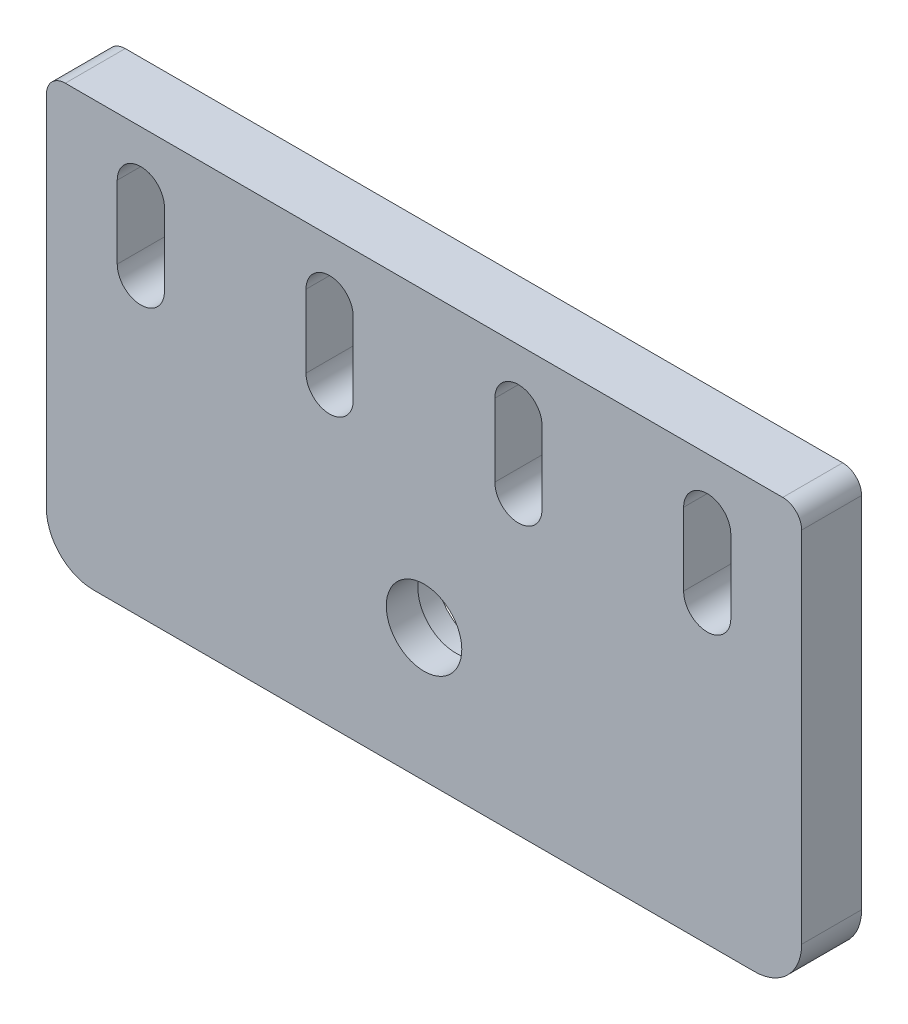
ISO-10303-21;
HEADER;
FILE_DESCRIPTION(('STEP AP214'),'2;1');
FILE_NAME('part.step','',(''),(''),'','','');
FILE_SCHEMA(('AUTOMOTIVE_DESIGN { 1 0 10303 214 1 1 1 1 }'));
ENDSEC;
DATA;
#1=APPLICATION_CONTEXT('core data for automotive mechanical design processes');
#2=APPLICATION_PROTOCOL_DEFINITION('international standard','automotive_design',2000,#1);
#3=PRODUCT_CONTEXT('',#1,'mechanical');
#4=PRODUCT('Part','Part','',(#3));
#5=PRODUCT_RELATED_PRODUCT_CATEGORY('part','',(#4));
#6=PRODUCT_DEFINITION_FORMATION('','',#4);
#7=PRODUCT_DEFINITION_CONTEXT('part definition',#1,'design');
#8=PRODUCT_DEFINITION('design','',#6,#7);
#9=PRODUCT_DEFINITION_SHAPE('','',#8);
#10=(LENGTH_UNIT() NAMED_UNIT(*) SI_UNIT(.MILLI.,.METRE.));
#11=(NAMED_UNIT(*) PLANE_ANGLE_UNIT() SI_UNIT($,.RADIAN.));
#12=(NAMED_UNIT(*) SI_UNIT($,.STERADIAN.) SOLID_ANGLE_UNIT());
#13=UNCERTAINTY_MEASURE_WITH_UNIT(LENGTH_MEASURE(1.E-05),#10,'distance_accuracy_value','');
#14=(GEOMETRIC_REPRESENTATION_CONTEXT(3) GLOBAL_UNCERTAINTY_ASSIGNED_CONTEXT((#13)) GLOBAL_UNIT_ASSIGNED_CONTEXT((#10,
#11,#12)) REPRESENTATION_CONTEXT('',''));
#15=CARTESIAN_POINT('',(0.,0.,0.));
#16=DIRECTION('',(0.,0.,1.));
#17=DIRECTION('',(1.,0.,0.));
#18=AXIS2_PLACEMENT_3D('',#15,#16,#17);
#19=CARTESIAN_POINT('',(10.0000009024611,-20.9499999999999,6.35));
#20=DIRECTION('',(0.,0.,-1.));
#21=DIRECTION('',(-1.,0.,0.));
#22=AXIS2_PLACEMENT_3D('',#19,#20,#21);
#23=CYLINDRICAL_SURFACE('',#22,4.00000000000009);
#24=CARTESIAN_POINT('',(10.0000009024611,-20.9499999999999,6.35));
#25=DIRECTION('',(0.,0.,1.));
#26=DIRECTION('',(1.,0.,0.));
#27=AXIS2_PLACEMENT_3D('',#24,#25,#26);
#28=CIRCLE('',#27,4.00000000000009);
#29=CARTESIAN_POINT('',(14.0000009024612,-20.9499999999999,6.35));
#30=VERTEX_POINT('',#29);
#31=EDGE_CURVE('E582',#30,#30,#28,.T.);
#32=ORIENTED_EDGE('',*,*,#31,.T.);
#33=EDGE_LOOP('',(#32));
#34=FACE_BOUND('',#33,.T.);
#35=CARTESIAN_POINT('',(10.0000009024611,-20.9499999999999,3.));
#36=DIRECTION('',(0.,0.,-1.));
#37=DIRECTION('',(-1.,0.,0.));
#38=AXIS2_PLACEMENT_3D('',#35,#36,#37);
#39=CIRCLE('',#38,4.00000000000009);
#40=CARTESIAN_POINT('',(6.00000090246104,-20.9499999999999,3.));
#41=VERTEX_POINT('',#40);
#42=EDGE_CURVE('E333',#41,#41,#39,.T.);
#43=ORIENTED_EDGE('',*,*,#42,.T.);
#44=EDGE_LOOP('',(#43));
#45=FACE_BOUND('',#44,.T.);
#46=ADVANCED_FACE('F329',(#34,#45),#23,.F.);
#47=CARTESIAN_POINT('',(45.0000009024611,-30.,6.35));
#48=DIRECTION('',(0.,0.,-1.));
#49=DIRECTION('',(-1.,0.,0.));
#50=AXIS2_PLACEMENT_3D('',#47,#48,#49);
#51=PLANE('',#50);
#52=CARTESIAN_POINT('',(40.0000009024611,-3.85,6.35));
#53=DIRECTION('',(0.,0.,1.));
#54=DIRECTION('',(1.,0.,0.));
#55=AXIS2_PLACEMENT_3D('',#52,#53,#54);
#56=CIRCLE('',#55,2.49999999999999);
#57=CARTESIAN_POINT('',(37.5000009024611,-3.85,6.35));
#58=VERTEX_POINT('',#57);
#59=CARTESIAN_POINT('',(42.5000009024611,-3.85,6.35));
#60=VERTEX_POINT('',#59);
#61=EDGE_CURVE('E509',#58,#60,#56,.T.);
#62=ORIENTED_EDGE('',*,*,#61,.F.);
#63=DIRECTION('',(0.,1.,0.));
#64=VECTOR('',#63,1.);
#65=CARTESIAN_POINT('',(37.5000009024611,-3.85,6.35));
#66=LINE('',#65,#64);
#67=CARTESIAN_POINT('',(37.5000009024611,3.85,6.35));
#68=VERTEX_POINT('',#67);
#69=EDGE_CURVE('E493',#58,#68,#66,.T.);
#70=ORIENTED_EDGE('',*,*,#69,.T.);
#71=CARTESIAN_POINT('',(40.0000009024611,3.85,6.35));
#72=DIRECTION('',(0.,0.,1.));
#73=DIRECTION('',(1.,0.,0.));
#74=AXIS2_PLACEMENT_3D('',#71,#72,#73);
#75=CIRCLE('',#74,2.49999999999999);
#76=CARTESIAN_POINT('',(42.5000009024611,3.85,6.35));
#77=VERTEX_POINT('',#76);
#78=EDGE_CURVE('E499',#77,#68,#75,.T.);
#79=ORIENTED_EDGE('',*,*,#78,.F.);
#80=DIRECTION('',(0.,1.,0.));
#81=VECTOR('',#80,1.);
#82=CARTESIAN_POINT('',(42.5000009024611,-3.85,6.35));
#83=LINE('',#82,#81);
#84=EDGE_CURVE('E510',#60,#77,#83,.T.);
#85=ORIENTED_EDGE('',*,*,#84,.F.);
#86=EDGE_LOOP('',(#62,#70,#79,#85));
#87=FACE_BOUND('',#86,.T.);
#88=CARTESIAN_POINT('',(9.02461126661702E-07,-3.85,6.35));
#89=DIRECTION('',(0.,0.,1.));
#90=DIRECTION('',(1.,0.,0.));
#91=AXIS2_PLACEMENT_3D('',#88,#89,#90);
#92=CIRCLE('',#91,2.49999999999999);
#93=CARTESIAN_POINT('',(-2.49999909753901,-3.85,6.35));
#94=VERTEX_POINT('',#93);
#95=CARTESIAN_POINT('',(2.50000090246112,-3.85,6.35));
#96=VERTEX_POINT('',#95);
#97=EDGE_CURVE('E527',#94,#96,#92,.T.);
#98=ORIENTED_EDGE('',*,*,#97,.F.);
#99=DIRECTION('',(0.,1.,0.));
#100=VECTOR('',#99,1.);
#101=CARTESIAN_POINT('',(-2.49999909753886,-3.85,6.35));
#102=LINE('',#101,#100);
#103=CARTESIAN_POINT('',(-2.49999909753886,3.85,6.35));
#104=VERTEX_POINT('',#103);
#105=EDGE_CURVE('E521',#94,#104,#102,.T.);
#106=ORIENTED_EDGE('',*,*,#105,.T.);
#107=CARTESIAN_POINT('',(9.02461126661702E-07,3.85,6.35));
#108=DIRECTION('',(0.,0.,1.));
#109=DIRECTION('',(1.,0.,0.));
#110=AXIS2_PLACEMENT_3D('',#107,#108,#109);
#111=CIRCLE('',#110,2.49999999999999);
#112=CARTESIAN_POINT('',(2.50000090246119,3.85,6.35));
#113=VERTEX_POINT('',#112);
#114=EDGE_CURVE('E535',#113,#104,#111,.T.);
#115=ORIENTED_EDGE('',*,*,#114,.F.);
#116=DIRECTION('',(0.,1.,0.));
#117=VECTOR('',#116,1.);
#118=CARTESIAN_POINT('',(2.50000090246119,-3.85,6.35));
#119=LINE('',#118,#117);
#120=EDGE_CURVE('E498',#96,#113,#119,.T.);
#121=ORIENTED_EDGE('',*,*,#120,.F.);
#122=EDGE_LOOP('',(#98,#106,#115,#121));
#123=FACE_BOUND('',#122,.T.);
#124=CARTESIAN_POINT('',(-19.9999990975389,-3.85,6.35));
#125=DIRECTION('',(0.,0.,1.));
#126=DIRECTION('',(1.,0.,0.));
#127=AXIS2_PLACEMENT_3D('',#124,#125,#126);
#128=CIRCLE('',#127,2.49999999999999);
#129=CARTESIAN_POINT('',(-22.499999097539,-3.85,6.35));
#130=VERTEX_POINT('',#129);
#131=CARTESIAN_POINT('',(-17.4999990975389,-3.85,6.35));
#132=VERTEX_POINT('',#131);
#133=EDGE_CURVE('E548',#130,#132,#128,.T.);
#134=ORIENTED_EDGE('',*,*,#133,.F.);
#135=DIRECTION('',(0.,1.,0.));
#136=VECTOR('',#135,1.);
#137=CARTESIAN_POINT('',(-22.4999990975389,-3.85,6.35));
#138=LINE('',#137,#136);
#139=CARTESIAN_POINT('',(-22.4999990975389,3.85,6.35));
#140=VERTEX_POINT('',#139);
#141=EDGE_CURVE('E542',#130,#140,#138,.T.);
#142=ORIENTED_EDGE('',*,*,#141,.T.);
#143=CARTESIAN_POINT('',(-19.9999990975389,3.85,6.35));
#144=DIRECTION('',(0.,0.,1.));
#145=DIRECTION('',(1.,0.,0.));
#146=AXIS2_PLACEMENT_3D('',#143,#144,#145);
#147=CIRCLE('',#146,2.49999999999999);
#148=CARTESIAN_POINT('',(-17.4999990975389,3.85,6.35));
#149=VERTEX_POINT('',#148);
#150=EDGE_CURVE('E556',#149,#140,#147,.T.);
#151=ORIENTED_EDGE('',*,*,#150,.F.);
#152=DIRECTION('',(0.,1.,0.));
#153=VECTOR('',#152,1.);
#154=CARTESIAN_POINT('',(-17.4999990975389,-3.85,6.35));
#155=LINE('',#154,#153);
#156=EDGE_CURVE('E540',#132,#149,#155,.T.);
#157=ORIENTED_EDGE('',*,*,#156,.F.);
#158=EDGE_LOOP('',(#134,#142,#151,#157));
#159=FACE_BOUND('',#158,.T.);
#160=CARTESIAN_POINT('',(20.0000009024611,-3.85,6.35));
#161=DIRECTION('',(0.,0.,1.));
#162=DIRECTION('',(1.,0.,0.));
#163=AXIS2_PLACEMENT_3D('',#160,#161,#162);
#164=CIRCLE('',#163,2.49999999999999);
#165=CARTESIAN_POINT('',(17.500000902461,-3.85,6.35));
#166=VERTEX_POINT('',#165);
#167=CARTESIAN_POINT('',(22.5000009024611,-3.85,6.35));
#168=VERTEX_POINT('',#167);
#169=EDGE_CURVE('E569',#166,#168,#164,.T.);
#170=ORIENTED_EDGE('',*,*,#169,.F.);
#171=DIRECTION('',(0.,1.,0.));
#172=VECTOR('',#171,1.);
#173=CARTESIAN_POINT('',(17.5000009024611,-3.85,6.35));
#174=LINE('',#173,#172);
#175=CARTESIAN_POINT('',(17.5000009024611,3.85,6.35));
#176=VERTEX_POINT('',#175);
#177=EDGE_CURVE('E563',#166,#176,#174,.T.);
#178=ORIENTED_EDGE('',*,*,#177,.T.);
#179=CARTESIAN_POINT('',(20.0000009024611,3.85,6.35));
#180=DIRECTION('',(0.,0.,1.));
#181=DIRECTION('',(1.,0.,0.));
#182=AXIS2_PLACEMENT_3D('',#179,#180,#181);
#183=CIRCLE('',#182,2.49999999999999);
#184=CARTESIAN_POINT('',(22.5000009024611,3.85,6.35));
#185=VERTEX_POINT('',#184);
#186=EDGE_CURVE('E577',#185,#176,#183,.T.);
#187=ORIENTED_EDGE('',*,*,#186,.F.);
#188=DIRECTION('',(0.,1.,0.));
#189=VECTOR('',#188,1.);
#190=CARTESIAN_POINT('',(22.5000009024611,-3.85,6.35));
#191=LINE('',#190,#189);
#192=EDGE_CURVE('E561',#168,#185,#191,.T.);
#193=ORIENTED_EDGE('',*,*,#192,.F.);
#194=EDGE_LOOP('',(#170,#178,#187,#193));
#195=FACE_BOUND('',#194,.T.);
#196=CARTESIAN_POINT('',(45.0000009024611,-30.,6.35));
#197=DIRECTION('',(0.,0.,1.));
#198=DIRECTION('',(-1.,0.,0.));
#199=AXIS2_PLACEMENT_3D('',#196,#197,#198);
#200=CIRCLE('',#199,5.00000000000001);
#201=CARTESIAN_POINT('',(45.0000009024611,-35.,6.35));
#202=VERTEX_POINT('',#201);
#203=CARTESIAN_POINT('',(50.0000009024611,-30.,6.35));
#204=VERTEX_POINT('',#203);
#205=EDGE_CURVE('E586',#202,#204,#200,.T.);
#206=ORIENTED_EDGE('',*,*,#205,.T.);
#207=DIRECTION('',(0.,1.,0.));
#208=VECTOR('',#207,1.);
#209=CARTESIAN_POINT('',(50.0000009024611,7.99999999999999,6.35));
#210=LINE('',#209,#208);
#211=CARTESIAN_POINT('',(50.0000009024611,7.99999999999999,6.35));
#212=VERTEX_POINT('',#211);
#213=EDGE_CURVE('E589',#204,#212,#210,.T.);
#214=ORIENTED_EDGE('',*,*,#213,.T.);
#215=CARTESIAN_POINT('',(48.0000009024611,8.00000000000001,6.35));
#216=DIRECTION('',(0.,0.,1.));
#217=DIRECTION('',(1.,0.,0.));
#218=AXIS2_PLACEMENT_3D('',#215,#216,#217);
#219=CIRCLE('',#218,2.);
#220=CARTESIAN_POINT('',(48.0000009024611,10.,6.35));
#221=VERTEX_POINT('',#220);
#222=EDGE_CURVE('E592',#212,#221,#219,.T.);
#223=ORIENTED_EDGE('',*,*,#222,.T.);
#224=DIRECTION('',(-1.,0.,0.));
#225=VECTOR('',#224,1.);
#226=CARTESIAN_POINT('',(-27.9999990975389,10.,6.35));
#227=LINE('',#226,#225);
#228=CARTESIAN_POINT('',(-27.9999990975389,10.,6.35));
#229=VERTEX_POINT('',#228);
#230=EDGE_CURVE('E594',#221,#229,#227,.T.);
#231=ORIENTED_EDGE('',*,*,#230,.T.);
#232=CARTESIAN_POINT('',(-27.9999990975389,8.00000000000001,6.35));
#233=DIRECTION('',(0.,0.,1.));
#234=DIRECTION('',(1.,0.,0.));
#235=AXIS2_PLACEMENT_3D('',#232,#233,#234);
#236=CIRCLE('',#235,2.);
#237=CARTESIAN_POINT('',(-29.9999990975389,7.99999999999999,6.35));
#238=VERTEX_POINT('',#237);
#239=EDGE_CURVE('E596',#229,#238,#236,.T.);
#240=ORIENTED_EDGE('',*,*,#239,.T.);
#241=DIRECTION('',(0.,-1.,0.));
#242=VECTOR('',#241,1.);
#243=CARTESIAN_POINT('',(-29.9999990975389,7.99999999999999,6.35));
#244=LINE('',#243,#242);
#245=CARTESIAN_POINT('',(-29.9999990975389,-30.,6.35));
#246=VERTEX_POINT('',#245);
#247=EDGE_CURVE('E598',#238,#246,#244,.T.);
#248=ORIENTED_EDGE('',*,*,#247,.T.);
#249=CARTESIAN_POINT('',(-24.9999990975389,-30.,6.35));
#250=DIRECTION('',(0.,0.,1.));
#251=DIRECTION('',(-1.,0.,0.));
#252=AXIS2_PLACEMENT_3D('',#249,#250,#251);
#253=CIRCLE('',#252,5.);
#254=CARTESIAN_POINT('',(-24.9999990975389,-35.,6.35));
#255=VERTEX_POINT('',#254);
#256=EDGE_CURVE('E600',#246,#255,#253,.T.);
#257=ORIENTED_EDGE('',*,*,#256,.T.);
#258=DIRECTION('',(1.,0.,0.));
#259=VECTOR('',#258,1.);
#260=CARTESIAN_POINT('',(-24.9999990975389,-35.,6.35));
#261=LINE('',#260,#259);
#262=EDGE_CURVE('E602',#255,#202,#261,.T.);
#263=ORIENTED_EDGE('',*,*,#262,.T.);
#264=EDGE_LOOP('',(#206,#214,#223,#231,#240,#248,#257,#263));
#265=FACE_BOUND('',#264,.T.);
#266=ORIENTED_EDGE('',*,*,#31,.F.);
#267=EDGE_LOOP('',(#266));
#268=FACE_BOUND('',#267,.T.);
#269=ADVANCED_FACE('F507',(#87,#123,#159,#195,#265,#268),#51,.F.);
#270=CARTESIAN_POINT('',(45.0000009024611,-30.,0.));
#271=DIRECTION('',(0.,0.,-1.));
#272=DIRECTION('',(-1.,0.,0.));
#273=AXIS2_PLACEMENT_3D('',#270,#271,#272);
#274=PLANE('',#273);
#275=CARTESIAN_POINT('',(10.0000009024611,-20.9499999999999,0.));
#276=DIRECTION('',(0.,0.,-1.));
#277=DIRECTION('',(-1.,0.,0.));
#278=AXIS2_PLACEMENT_3D('',#275,#276,#277);
#279=CIRCLE('',#278,5.25);
#280=CARTESIAN_POINT('',(4.75000090246113,-20.9499999999999,0.));
#281=VERTEX_POINT('',#280);
#282=EDGE_CURVE('E950',#281,#281,#279,.T.);
#283=ORIENTED_EDGE('',*,*,#282,.F.);
#284=EDGE_LOOP('',(#283));
#285=FACE_BOUND('',#284,.T.);
#286=DIRECTION('',(0.,1.,0.));
#287=VECTOR('',#286,1.);
#288=CARTESIAN_POINT('',(37.5000009024611,-30.,0.));
#289=LINE('',#288,#287);
#290=CARTESIAN_POINT('',(37.5000009024611,-3.85,0.));
#291=VERTEX_POINT('',#290);
#292=CARTESIAN_POINT('',(37.5000009024611,3.85,0.));
#293=VERTEX_POINT('',#292);
#294=EDGE_CURVE('E13',#291,#293,#289,.T.);
#295=ORIENTED_EDGE('',*,*,#294,.F.);
#296=CARTESIAN_POINT('',(40.0000009024611,-3.85,0.));
#297=DIRECTION('',(0.,0.,-1.));
#298=DIRECTION('',(-1.,0.,0.));
#299=AXIS2_PLACEMENT_3D('',#296,#297,#298);
#300=CIRCLE('',#299,2.49999999999999);
#301=CARTESIAN_POINT('',(42.5000009024611,-3.85,0.));
#302=VERTEX_POINT('',#301);
#303=EDGE_CURVE('E672',#302,#291,#300,.T.);
#304=ORIENTED_EDGE('',*,*,#303,.F.);
#305=DIRECTION('',(0.,-1.,0.));
#306=VECTOR('',#305,1.);
#307=CARTESIAN_POINT('',(42.5000009024611,-30.,0.));
#308=LINE('',#307,#306);
#309=CARTESIAN_POINT('',(42.5000009024611,3.85,0.));
#310=VERTEX_POINT('',#309);
#311=EDGE_CURVE('E670',#310,#302,#308,.T.);
#312=ORIENTED_EDGE('',*,*,#311,.F.);
#313=CARTESIAN_POINT('',(40.0000009024611,3.85,0.));
#314=DIRECTION('',(0.,0.,-1.));
#315=DIRECTION('',(-1.,0.,0.));
#316=AXIS2_PLACEMENT_3D('',#313,#314,#315);
#317=CIRCLE('',#316,2.49999999999999);
#318=EDGE_CURVE('E338',#293,#310,#317,.T.);
#319=ORIENTED_EDGE('',*,*,#318,.F.);
#320=EDGE_LOOP('',(#295,#304,#312,#319));
#321=FACE_BOUND('',#320,.T.);
#322=DIRECTION('',(0.,1.,0.));
#323=VECTOR('',#322,1.);
#324=CARTESIAN_POINT('',(-2.49999909753886,-30.,0.));
#325=LINE('',#324,#323);
#326=CARTESIAN_POINT('',(-2.49999909753886,-3.85,0.));
#327=VERTEX_POINT('',#326);
#328=CARTESIAN_POINT('',(-2.49999909753886,3.85,0.));
#329=VERTEX_POINT('',#328);
#330=EDGE_CURVE('E668',#327,#329,#325,.T.);
#331=ORIENTED_EDGE('',*,*,#330,.F.);
#332=CARTESIAN_POINT('',(9.02461126661702E-07,-3.85,0.));
#333=DIRECTION('',(0.,0.,-1.));
#334=DIRECTION('',(-1.,0.,0.));
#335=AXIS2_PLACEMENT_3D('',#332,#333,#334);
#336=CIRCLE('',#335,2.49999999999999);
#337=CARTESIAN_POINT('',(2.50000090246112,-3.85,0.));
#338=VERTEX_POINT('',#337);
#339=EDGE_CURVE('E663',#338,#327,#336,.T.);
#340=ORIENTED_EDGE('',*,*,#339,.F.);
#341=DIRECTION('',(0.,-1.,0.));
#342=VECTOR('',#341,1.);
#343=CARTESIAN_POINT('',(2.50000090246112,-30.,0.));
#344=LINE('',#343,#342);
#345=CARTESIAN_POINT('',(2.50000090246112,3.85,0.));
#346=VERTEX_POINT('',#345);
#347=EDGE_CURVE('E661',#346,#338,#344,.T.);
#348=ORIENTED_EDGE('',*,*,#347,.F.);
#349=CARTESIAN_POINT('',(9.02461126661702E-07,3.85,0.));
#350=DIRECTION('',(0.,0.,-1.));
#351=DIRECTION('',(-1.,0.,0.));
#352=AXIS2_PLACEMENT_3D('',#349,#350,#351);
#353=CIRCLE('',#352,2.49999999999999);
#354=EDGE_CURVE('E665',#329,#346,#353,.T.);
#355=ORIENTED_EDGE('',*,*,#354,.F.);
#356=EDGE_LOOP('',(#331,#340,#348,#355));
#357=FACE_BOUND('',#356,.T.);
#358=DIRECTION('',(0.,1.,0.));
#359=VECTOR('',#358,1.);
#360=CARTESIAN_POINT('',(-22.4999990975389,-30.,0.));
#361=LINE('',#360,#359);
#362=CARTESIAN_POINT('',(-22.4999990975389,-3.85,0.));
#363=VERTEX_POINT('',#362);
#364=CARTESIAN_POINT('',(-22.4999990975389,3.85,0.));
#365=VERTEX_POINT('',#364);
#366=EDGE_CURVE('E659',#363,#365,#361,.T.);
#367=ORIENTED_EDGE('',*,*,#366,.F.);
#368=CARTESIAN_POINT('',(-19.9999990975389,-3.85,0.));
#369=DIRECTION('',(0.,0.,-1.));
#370=DIRECTION('',(-1.,0.,0.));
#371=AXIS2_PLACEMENT_3D('',#368,#369,#370);
#372=CIRCLE('',#371,2.49999999999999);
#373=CARTESIAN_POINT('',(-17.4999990975389,-3.85,0.));
#374=VERTEX_POINT('',#373);
#375=EDGE_CURVE('E654',#374,#363,#372,.T.);
#376=ORIENTED_EDGE('',*,*,#375,.F.);
#377=DIRECTION('',(0.,-1.,0.));
#378=VECTOR('',#377,1.);
#379=CARTESIAN_POINT('',(-17.4999990975389,-30.,0.));
#380=LINE('',#379,#378);
#381=CARTESIAN_POINT('',(-17.4999990975389,3.85,0.));
#382=VERTEX_POINT('',#381);
#383=EDGE_CURVE('E652',#382,#374,#380,.T.);
#384=ORIENTED_EDGE('',*,*,#383,.F.);
#385=CARTESIAN_POINT('',(-19.9999990975389,3.85,0.));
#386=DIRECTION('',(0.,0.,-1.));
#387=DIRECTION('',(-1.,0.,0.));
#388=AXIS2_PLACEMENT_3D('',#385,#386,#387);
#389=CIRCLE('',#388,2.49999999999999);
#390=EDGE_CURVE('E656',#365,#382,#389,.T.);
#391=ORIENTED_EDGE('',*,*,#390,.F.);
#392=EDGE_LOOP('',(#367,#376,#384,#391));
#393=FACE_BOUND('',#392,.T.);
#394=DIRECTION('',(0.,1.,0.));
#395=VECTOR('',#394,1.);
#396=CARTESIAN_POINT('',(17.5000009024611,-30.,0.));
#397=LINE('',#396,#395);
#398=CARTESIAN_POINT('',(17.5000009024611,-3.85,0.));
#399=VERTEX_POINT('',#398);
#400=CARTESIAN_POINT('',(17.5000009024611,3.85,0.));
#401=VERTEX_POINT('',#400);
#402=EDGE_CURVE('E650',#399,#401,#397,.T.);
#403=ORIENTED_EDGE('',*,*,#402,.F.);
#404=CARTESIAN_POINT('',(20.0000009024611,-3.85,0.));
#405=DIRECTION('',(0.,0.,-1.));
#406=DIRECTION('',(-1.,0.,0.));
#407=AXIS2_PLACEMENT_3D('',#404,#405,#406);
#408=CIRCLE('',#407,2.49999999999999);
#409=CARTESIAN_POINT('',(22.5000009024611,-3.85,0.));
#410=VERTEX_POINT('',#409);
#411=EDGE_CURVE('E645',#410,#399,#408,.T.);
#412=ORIENTED_EDGE('',*,*,#411,.F.);
#413=DIRECTION('',(0.,-1.,0.));
#414=VECTOR('',#413,1.);
#415=CARTESIAN_POINT('',(22.5000009024611,-30.,0.));
#416=LINE('',#415,#414);
#417=CARTESIAN_POINT('',(22.5000009024611,3.85,0.));
#418=VERTEX_POINT('',#417);
#419=EDGE_CURVE('E643',#418,#410,#416,.T.);
#420=ORIENTED_EDGE('',*,*,#419,.F.);
#421=CARTESIAN_POINT('',(20.0000009024611,3.85,0.));
#422=DIRECTION('',(0.,0.,-1.));
#423=DIRECTION('',(-1.,0.,0.));
#424=AXIS2_PLACEMENT_3D('',#421,#422,#423);
#425=CIRCLE('',#424,2.49999999999999);
#426=EDGE_CURVE('E647',#401,#418,#425,.T.);
#427=ORIENTED_EDGE('',*,*,#426,.F.);
#428=EDGE_LOOP('',(#403,#412,#420,#427));
#429=FACE_BOUND('',#428,.T.);
#430=CARTESIAN_POINT('',(45.0000009024611,-30.,0.));
#431=DIRECTION('',(0.,0.,1.));
#432=DIRECTION('',(-1.,0.,0.));
#433=AXIS2_PLACEMENT_3D('',#430,#431,#432);
#434=CIRCLE('',#433,5.00000000000001);
#435=CARTESIAN_POINT('',(45.0000009024611,-35.,0.));
#436=VERTEX_POINT('',#435);
#437=CARTESIAN_POINT('',(50.0000009024611,-30.,0.));
#438=VERTEX_POINT('',#437);
#439=EDGE_CURVE('E585',#436,#438,#434,.T.);
#440=ORIENTED_EDGE('',*,*,#439,.F.);
#441=DIRECTION('',(1.,0.,0.));
#442=VECTOR('',#441,1.);
#443=CARTESIAN_POINT('',(-24.9999990975389,-35.,0.));
#444=LINE('',#443,#442);
#445=CARTESIAN_POINT('',(-24.9999990975389,-35.,0.));
#446=VERTEX_POINT('',#445);
#447=EDGE_CURVE('E590',#446,#436,#444,.T.);
#448=ORIENTED_EDGE('',*,*,#447,.F.);
#449=CARTESIAN_POINT('',(-24.9999990975389,-30.,0.));
#450=DIRECTION('',(0.,0.,1.));
#451=DIRECTION('',(-1.,0.,0.));
#452=AXIS2_PLACEMENT_3D('',#449,#450,#451);
#453=CIRCLE('',#452,5.);
#454=CARTESIAN_POINT('',(-29.9999990975389,-30.,0.));
#455=VERTEX_POINT('',#454);
#456=EDGE_CURVE('E617',#455,#446,#453,.T.);
#457=ORIENTED_EDGE('',*,*,#456,.F.);
#458=DIRECTION('',(0.,-1.,0.));
#459=VECTOR('',#458,1.);
#460=CARTESIAN_POINT('',(-29.9999990975389,7.99999999999999,0.));
#461=LINE('',#460,#459);
#462=CARTESIAN_POINT('',(-29.9999990975389,7.99999999999999,0.));
#463=VERTEX_POINT('',#462);
#464=EDGE_CURVE('E615',#463,#455,#461,.T.);
#465=ORIENTED_EDGE('',*,*,#464,.F.);
#466=CARTESIAN_POINT('',(-27.9999990975389,8.00000000000001,0.));
#467=DIRECTION('',(0.,0.,1.));
#468=DIRECTION('',(1.,0.,0.));
#469=AXIS2_PLACEMENT_3D('',#466,#467,#468);
#470=CIRCLE('',#469,2.);
#471=CARTESIAN_POINT('',(-27.9999990975389,10.,0.));
#472=VERTEX_POINT('',#471);
#473=EDGE_CURVE('E613',#472,#463,#470,.T.);
#474=ORIENTED_EDGE('',*,*,#473,.F.);
#475=DIRECTION('',(-1.,0.,0.));
#476=VECTOR('',#475,1.);
#477=CARTESIAN_POINT('',(-27.9999990975389,10.,0.));
#478=LINE('',#477,#476);
#479=CARTESIAN_POINT('',(48.0000009024611,10.,0.));
#480=VERTEX_POINT('',#479);
#481=EDGE_CURVE('E611',#480,#472,#478,.T.);
#482=ORIENTED_EDGE('',*,*,#481,.F.);
#483=CARTESIAN_POINT('',(48.0000009024611,8.00000000000001,0.));
#484=DIRECTION('',(0.,0.,1.));
#485=DIRECTION('',(1.,0.,0.));
#486=AXIS2_PLACEMENT_3D('',#483,#484,#485);
#487=CIRCLE('',#486,2.);
#488=CARTESIAN_POINT('',(50.0000009024611,7.99999999999999,0.));
#489=VERTEX_POINT('',#488);
#490=EDGE_CURVE('E609',#489,#480,#487,.T.);
#491=ORIENTED_EDGE('',*,*,#490,.F.);
#492=DIRECTION('',(0.,1.,0.));
#493=VECTOR('',#492,1.);
#494=CARTESIAN_POINT('',(50.0000009024611,7.99999999999999,0.));
#495=LINE('',#494,#493);
#496=EDGE_CURVE('E607',#438,#489,#495,.T.);
#497=ORIENTED_EDGE('',*,*,#496,.F.);
#498=EDGE_LOOP('',(#440,#448,#457,#465,#474,#482,#491,#497));
#499=FACE_BOUND('',#498,.T.);
#500=ADVANCED_FACE('F677',(#285,#321,#357,#393,#429,#499),#274,.T.);
#501=CARTESIAN_POINT('',(45.0000009024611,-30.,6.35));
#502=DIRECTION('',(0.,0.,-1.));
#503=DIRECTION('',(-1.,0.,0.));
#504=AXIS2_PLACEMENT_3D('',#501,#502,#503);
#505=CYLINDRICAL_SURFACE('',#504,5.00000000000001);
#506=ORIENTED_EDGE('',*,*,#439,.T.);
#507=DIRECTION('',(0.,0.,-1.));
#508=VECTOR('',#507,1.);
#509=CARTESIAN_POINT('',(50.0000009024611,-30.,6.35));
#510=LINE('',#509,#508);
#511=EDGE_CURVE('E640',#204,#438,#510,.T.);
#512=ORIENTED_EDGE('',*,*,#511,.F.);
#513=ORIENTED_EDGE('',*,*,#205,.F.);
#514=DIRECTION('',(0.,0.,-1.));
#515=VECTOR('',#514,1.);
#516=CARTESIAN_POINT('',(45.0000009024611,-35.,6.35));
#517=LINE('',#516,#515);
#518=EDGE_CURVE('E604',#202,#436,#517,.T.);
#519=ORIENTED_EDGE('',*,*,#518,.T.);
#520=EDGE_LOOP('',(#506,#512,#513,#519));
#521=FACE_BOUND('',#520,.T.);
#522=ADVANCED_FACE('F331',(#521),#505,.T.);
#523=CARTESIAN_POINT('',(50.0000009024611,7.99999999999999,6.35));
#524=DIRECTION('',(-1.,0.,0.));
#525=DIRECTION('',(0.,-1.,0.));
#526=AXIS2_PLACEMENT_3D('',#523,#524,#525);
#527=PLANE('',#526);
#528=ORIENTED_EDGE('',*,*,#496,.T.);
#529=DIRECTION('',(0.,0.,-1.));
#530=VECTOR('',#529,1.);
#531=CARTESIAN_POINT('',(50.0000009024611,7.99999999999999,6.35));
#532=LINE('',#531,#530);
#533=EDGE_CURVE('E637',#212,#489,#532,.T.);
#534=ORIENTED_EDGE('',*,*,#533,.F.);
#535=ORIENTED_EDGE('',*,*,#213,.F.);
#536=ORIENTED_EDGE('',*,*,#511,.T.);
#537=EDGE_LOOP('',(#528,#534,#535,#536));
#538=FACE_BOUND('',#537,.T.);
#539=ADVANCED_FACE('F728',(#538),#527,.F.);
#540=CARTESIAN_POINT('',(48.0000009024611,8.00000000000001,6.35));
#541=DIRECTION('',(0.,0.,-1.));
#542=DIRECTION('',(-1.,0.,0.));
#543=AXIS2_PLACEMENT_3D('',#540,#541,#542);
#544=CYLINDRICAL_SURFACE('',#543,2.);
#545=ORIENTED_EDGE('',*,*,#490,.T.);
#546=DIRECTION('',(0.,0.,-1.));
#547=VECTOR('',#546,1.);
#548=CARTESIAN_POINT('',(48.0000009024611,10.,6.35));
#549=LINE('',#548,#547);
#550=EDGE_CURVE('E634',#221,#480,#549,.T.);
#551=ORIENTED_EDGE('',*,*,#550,.F.);
#552=ORIENTED_EDGE('',*,*,#222,.F.);
#553=ORIENTED_EDGE('',*,*,#533,.T.);
#554=EDGE_LOOP('',(#545,#551,#552,#553));
#555=FACE_BOUND('',#554,.T.);
#556=ADVANCED_FACE('F725',(#555),#544,.T.);
#557=CARTESIAN_POINT('',(-27.9999990975389,10.,6.35));
#558=DIRECTION('',(0.,-1.,0.));
#559=DIRECTION('',(1.,0.,0.));
#560=AXIS2_PLACEMENT_3D('',#557,#558,#559);
#561=PLANE('',#560);
#562=ORIENTED_EDGE('',*,*,#481,.T.);
#563=DIRECTION('',(0.,0.,-1.));
#564=VECTOR('',#563,1.);
#565=CARTESIAN_POINT('',(-27.9999990975389,10.,6.35));
#566=LINE('',#565,#564);
#567=EDGE_CURVE('E631',#229,#472,#566,.T.);
#568=ORIENTED_EDGE('',*,*,#567,.F.);
#569=ORIENTED_EDGE('',*,*,#230,.F.);
#570=ORIENTED_EDGE('',*,*,#550,.T.);
#571=EDGE_LOOP('',(#562,#568,#569,#570));
#572=FACE_BOUND('',#571,.T.);
#573=ADVANCED_FACE('F721',(#572),#561,.F.);
#574=CARTESIAN_POINT('',(-27.9999990975389,8.00000000000001,6.35));
#575=DIRECTION('',(0.,0.,-1.));
#576=DIRECTION('',(-1.,0.,0.));
#577=AXIS2_PLACEMENT_3D('',#574,#575,#576);
#578=CYLINDRICAL_SURFACE('',#577,2.);
#579=ORIENTED_EDGE('',*,*,#473,.T.);
#580=DIRECTION('',(0.,0.,-1.));
#581=VECTOR('',#580,1.);
#582=CARTESIAN_POINT('',(-29.9999990975389,7.99999999999999,6.35));
#583=LINE('',#582,#581);
#584=EDGE_CURVE('E628',#238,#463,#583,.T.);
#585=ORIENTED_EDGE('',*,*,#584,.F.);
#586=ORIENTED_EDGE('',*,*,#239,.F.);
#587=ORIENTED_EDGE('',*,*,#567,.T.);
#588=EDGE_LOOP('',(#579,#585,#586,#587));
#589=FACE_BOUND('',#588,.T.);
#590=ADVANCED_FACE('F717',(#589),#578,.T.);
#591=CARTESIAN_POINT('',(-29.9999990975389,7.99999999999999,6.35));
#592=DIRECTION('',(1.,0.,0.));
#593=DIRECTION('',(0.,1.,0.));
#594=AXIS2_PLACEMENT_3D('',#591,#592,#593);
#595=PLANE('',#594);
#596=ORIENTED_EDGE('',*,*,#464,.T.);
#597=DIRECTION('',(0.,0.,-1.));
#598=VECTOR('',#597,1.);
#599=CARTESIAN_POINT('',(-29.9999990975389,-30.,6.35));
#600=LINE('',#599,#598);
#601=EDGE_CURVE('E625',#246,#455,#600,.T.);
#602=ORIENTED_EDGE('',*,*,#601,.F.);
#603=ORIENTED_EDGE('',*,*,#247,.F.);
#604=ORIENTED_EDGE('',*,*,#584,.T.);
#605=EDGE_LOOP('',(#596,#602,#603,#604));
#606=FACE_BOUND('',#605,.T.);
#607=ADVANCED_FACE('F713',(#606),#595,.F.);
#608=CARTESIAN_POINT('',(-24.9999990975389,-30.,6.35));
#609=DIRECTION('',(0.,0.,-1.));
#610=DIRECTION('',(-1.,0.,0.));
#611=AXIS2_PLACEMENT_3D('',#608,#609,#610);
#612=CYLINDRICAL_SURFACE('',#611,5.);
#613=ORIENTED_EDGE('',*,*,#456,.T.);
#614=DIRECTION('',(0.,0.,-1.));
#615=VECTOR('',#614,1.);
#616=CARTESIAN_POINT('',(-24.9999990975389,-35.,6.35));
#617=LINE('',#616,#615);
#618=EDGE_CURVE('E622',#255,#446,#617,.T.);
#619=ORIENTED_EDGE('',*,*,#618,.F.);
#620=ORIENTED_EDGE('',*,*,#256,.F.);
#621=ORIENTED_EDGE('',*,*,#601,.T.);
#622=EDGE_LOOP('',(#613,#619,#620,#621));
#623=FACE_BOUND('',#622,.T.);
#624=ADVANCED_FACE('F709',(#623),#612,.T.);
#625=CARTESIAN_POINT('',(-24.9999990975389,-35.,6.35));
#626=DIRECTION('',(0.,1.,0.));
#627=DIRECTION('',(0.,0.,1.));
#628=AXIS2_PLACEMENT_3D('',#625,#626,#627);
#629=PLANE('',#628);
#630=ORIENTED_EDGE('',*,*,#447,.T.);
#631=ORIENTED_EDGE('',*,*,#518,.F.);
#632=ORIENTED_EDGE('',*,*,#262,.F.);
#633=ORIENTED_EDGE('',*,*,#618,.T.);
#634=EDGE_LOOP('',(#630,#631,#632,#633));
#635=FACE_BOUND('',#634,.T.);
#636=ADVANCED_FACE('F706',(#635),#629,.F.);
#637=CARTESIAN_POINT('',(20.0000009024611,3.85,6.35));
#638=DIRECTION('',(0.,0.,1.));
#639=DIRECTION('',(1.,0.,0.));
#640=AXIS2_PLACEMENT_3D('',#637,#638,#639);
#641=CYLINDRICAL_SURFACE('',#640,2.49999999999999);
#642=ORIENTED_EDGE('',*,*,#426,.T.);
#643=DIRECTION('',(0.,0.,-1.));
#644=VECTOR('',#643,1.);
#645=CARTESIAN_POINT('',(22.5000009024611,3.85,-3.65));
#646=LINE('',#645,#644);
#647=EDGE_CURVE('E575',#185,#418,#646,.T.);
#648=ORIENTED_EDGE('',*,*,#647,.F.);
#649=ORIENTED_EDGE('',*,*,#186,.T.);
#650=DIRECTION('',(0.,0.,1.));
#651=VECTOR('',#650,1.);
#652=CARTESIAN_POINT('',(17.5000009024611,3.85,6.35));
#653=LINE('',#652,#651);
#654=EDGE_CURVE('E580',#401,#176,#653,.T.);
#655=ORIENTED_EDGE('',*,*,#654,.F.);
#656=EDGE_LOOP('',(#642,#648,#649,#655));
#657=FACE_BOUND('',#656,.T.);
#658=ADVANCED_FACE('F700',(#657),#641,.F.);
#659=CARTESIAN_POINT('',(20.0000009024611,-3.85,6.35));
#660=DIRECTION('',(0.,0.,1.));
#661=DIRECTION('',(1.,0.,0.));
#662=AXIS2_PLACEMENT_3D('',#659,#660,#661);
#663=CYLINDRICAL_SURFACE('',#662,2.49999999999999);
#664=ORIENTED_EDGE('',*,*,#411,.T.);
#665=DIRECTION('',(0.,0.,1.));
#666=VECTOR('',#665,1.);
#667=CARTESIAN_POINT('',(17.5000009024611,-3.85,6.35));
#668=LINE('',#667,#666);
#669=EDGE_CURVE('E572',#166,#399,#668,.F.);
#670=ORIENTED_EDGE('',*,*,#669,.F.);
#671=ORIENTED_EDGE('',*,*,#169,.T.);
#672=DIRECTION('',(0.,0.,-1.));
#673=VECTOR('',#672,1.);
#674=CARTESIAN_POINT('',(22.5000009024611,-3.85,-3.65));
#675=LINE('',#674,#673);
#676=EDGE_CURVE('E566',#168,#410,#675,.T.);
#677=ORIENTED_EDGE('',*,*,#676,.T.);
#678=EDGE_LOOP('',(#664,#670,#671,#677));
#679=FACE_BOUND('',#678,.T.);
#680=ADVANCED_FACE('F786',(#679),#663,.F.);
#681=CARTESIAN_POINT('',(17.5000009024611,-3.85,6.35));
#682=DIRECTION('',(-1.,0.,0.));
#683=DIRECTION('',(0.,0.,1.));
#684=AXIS2_PLACEMENT_3D('',#681,#682,#683);
#685=PLANE('',#684);
#686=ORIENTED_EDGE('',*,*,#402,.T.);
#687=ORIENTED_EDGE('',*,*,#654,.T.);
#688=ORIENTED_EDGE('',*,*,#177,.F.);
#689=ORIENTED_EDGE('',*,*,#669,.T.);
#690=EDGE_LOOP('',(#686,#687,#688,#689));
#691=FACE_BOUND('',#690,.T.);
#692=ADVANCED_FACE('F795',(#691),#685,.F.);
#693=CARTESIAN_POINT('',(22.5000009024611,-3.85,-3.65));
#694=DIRECTION('',(1.,0.,0.));
#695=DIRECTION('',(0.,0.,-1.));
#696=AXIS2_PLACEMENT_3D('',#693,#694,#695);
#697=PLANE('',#696);
#698=ORIENTED_EDGE('',*,*,#419,.T.);
#699=ORIENTED_EDGE('',*,*,#676,.F.);
#700=ORIENTED_EDGE('',*,*,#192,.T.);
#701=ORIENTED_EDGE('',*,*,#647,.T.);
#702=EDGE_LOOP('',(#698,#699,#700,#701));
#703=FACE_BOUND('',#702,.T.);
#704=ADVANCED_FACE('F804',(#703),#697,.F.);
#705=CARTESIAN_POINT('',(-19.9999990975389,3.85,6.35));
#706=DIRECTION('',(0.,0.,1.));
#707=DIRECTION('',(1.,0.,0.));
#708=AXIS2_PLACEMENT_3D('',#705,#706,#707);
#709=CYLINDRICAL_SURFACE('',#708,2.49999999999999);
#710=ORIENTED_EDGE('',*,*,#390,.T.);
#711=DIRECTION('',(0.,0.,-1.));
#712=VECTOR('',#711,1.);
#713=CARTESIAN_POINT('',(-17.4999990975389,3.85,-3.65));
#714=LINE('',#713,#712);
#715=EDGE_CURVE('E554',#149,#382,#714,.T.);
#716=ORIENTED_EDGE('',*,*,#715,.F.);
#717=ORIENTED_EDGE('',*,*,#150,.T.);
#718=DIRECTION('',(0.,0.,1.));
#719=VECTOR('',#718,1.);
#720=CARTESIAN_POINT('',(-22.4999990975389,3.85,6.35));
#721=LINE('',#720,#719);
#722=EDGE_CURVE('E559',#365,#140,#721,.T.);
#723=ORIENTED_EDGE('',*,*,#722,.F.);
#724=EDGE_LOOP('',(#710,#716,#717,#723));
#725=FACE_BOUND('',#724,.T.);
#726=ADVANCED_FACE('F814',(#725),#709,.F.);
#727=CARTESIAN_POINT('',(-19.9999990975389,-3.85,6.35));
#728=DIRECTION('',(0.,0.,1.));
#729=DIRECTION('',(1.,0.,0.));
#730=AXIS2_PLACEMENT_3D('',#727,#728,#729);
#731=CYLINDRICAL_SURFACE('',#730,2.49999999999999);
#732=ORIENTED_EDGE('',*,*,#375,.T.);
#733=DIRECTION('',(0.,0.,1.));
#734=VECTOR('',#733,1.);
#735=CARTESIAN_POINT('',(-22.4999990975389,-3.85,6.35));
#736=LINE('',#735,#734);
#737=EDGE_CURVE('E551',#130,#363,#736,.F.);
#738=ORIENTED_EDGE('',*,*,#737,.F.);
#739=ORIENTED_EDGE('',*,*,#133,.T.);
#740=DIRECTION('',(0.,0.,-1.));
#741=VECTOR('',#740,1.);
#742=CARTESIAN_POINT('',(-17.4999990975389,-3.85,-3.65));
#743=LINE('',#742,#741);
#744=EDGE_CURVE('E545',#132,#374,#743,.T.);
#745=ORIENTED_EDGE('',*,*,#744,.T.);
#746=EDGE_LOOP('',(#732,#738,#739,#745));
#747=FACE_BOUND('',#746,.T.);
#748=ADVANCED_FACE('F824',(#747),#731,.F.);
#749=CARTESIAN_POINT('',(-22.4999990975389,-3.85,6.35));
#750=DIRECTION('',(-1.,0.,0.));
#751=DIRECTION('',(0.,0.,1.));
#752=AXIS2_PLACEMENT_3D('',#749,#750,#751);
#753=PLANE('',#752);
#754=ORIENTED_EDGE('',*,*,#366,.T.);
#755=ORIENTED_EDGE('',*,*,#722,.T.);
#756=ORIENTED_EDGE('',*,*,#141,.F.);
#757=ORIENTED_EDGE('',*,*,#737,.T.);
#758=EDGE_LOOP('',(#754,#755,#756,#757));
#759=FACE_BOUND('',#758,.T.);
#760=ADVANCED_FACE('F834',(#759),#753,.F.);
#761=CARTESIAN_POINT('',(-17.4999990975389,-3.85,-3.65));
#762=DIRECTION('',(1.,0.,0.));
#763=DIRECTION('',(0.,0.,-1.));
#764=AXIS2_PLACEMENT_3D('',#761,#762,#763);
#765=PLANE('',#764);
#766=ORIENTED_EDGE('',*,*,#383,.T.);
#767=ORIENTED_EDGE('',*,*,#744,.F.);
#768=ORIENTED_EDGE('',*,*,#156,.T.);
#769=ORIENTED_EDGE('',*,*,#715,.T.);
#770=EDGE_LOOP('',(#766,#767,#768,#769));
#771=FACE_BOUND('',#770,.T.);
#772=ADVANCED_FACE('F844',(#771),#765,.F.);
#773=CARTESIAN_POINT('',(9.02461126661702E-07,3.85,6.35));
#774=DIRECTION('',(0.,0.,1.));
#775=DIRECTION('',(1.,0.,0.));
#776=AXIS2_PLACEMENT_3D('',#773,#774,#775);
#777=CYLINDRICAL_SURFACE('',#776,2.49999999999999);
#778=ORIENTED_EDGE('',*,*,#354,.T.);
#779=DIRECTION('',(0.,0.,-1.));
#780=VECTOR('',#779,1.);
#781=CARTESIAN_POINT('',(2.50000090246111,3.85,-3.65));
#782=LINE('',#781,#780);
#783=EDGE_CURVE('E533',#113,#346,#782,.T.);
#784=ORIENTED_EDGE('',*,*,#783,.F.);
#785=ORIENTED_EDGE('',*,*,#114,.T.);
#786=DIRECTION('',(0.,0.,1.));
#787=VECTOR('',#786,1.);
#788=CARTESIAN_POINT('',(-2.49999909753886,3.85,6.35));
#789=LINE('',#788,#787);
#790=EDGE_CURVE('E538',#329,#104,#789,.T.);
#791=ORIENTED_EDGE('',*,*,#790,.F.);
#792=EDGE_LOOP('',(#778,#784,#785,#791));
#793=FACE_BOUND('',#792,.T.);
#794=ADVANCED_FACE('F854',(#793),#777,.F.);
#795=CARTESIAN_POINT('',(9.02461126661702E-07,-3.85,6.35));
#796=DIRECTION('',(0.,0.,1.));
#797=DIRECTION('',(1.,0.,0.));
#798=AXIS2_PLACEMENT_3D('',#795,#796,#797);
#799=CYLINDRICAL_SURFACE('',#798,2.49999999999999);
#800=ORIENTED_EDGE('',*,*,#339,.T.);
#801=DIRECTION('',(0.,0.,1.));
#802=VECTOR('',#801,1.);
#803=CARTESIAN_POINT('',(-2.49999909753886,-3.85,6.35));
#804=LINE('',#803,#802);
#805=EDGE_CURVE('E530',#94,#327,#804,.F.);
#806=ORIENTED_EDGE('',*,*,#805,.F.);
#807=ORIENTED_EDGE('',*,*,#97,.T.);
#808=DIRECTION('',(0.,0.,-1.));
#809=VECTOR('',#808,1.);
#810=CARTESIAN_POINT('',(2.50000090246111,-3.85,-3.65));
#811=LINE('',#810,#809);
#812=EDGE_CURVE('E524',#96,#338,#811,.T.);
#813=ORIENTED_EDGE('',*,*,#812,.T.);
#814=EDGE_LOOP('',(#800,#806,#807,#813));
#815=FACE_BOUND('',#814,.T.);
#816=ADVANCED_FACE('F864',(#815),#799,.F.);
#817=CARTESIAN_POINT('',(-2.49999909753886,-3.85,6.35));
#818=DIRECTION('',(-1.,0.,0.));
#819=DIRECTION('',(0.,0.,1.));
#820=AXIS2_PLACEMENT_3D('',#817,#818,#819);
#821=PLANE('',#820);
#822=ORIENTED_EDGE('',*,*,#330,.T.);
#823=ORIENTED_EDGE('',*,*,#790,.T.);
#824=ORIENTED_EDGE('',*,*,#105,.F.);
#825=ORIENTED_EDGE('',*,*,#805,.T.);
#826=EDGE_LOOP('',(#822,#823,#824,#825));
#827=FACE_BOUND('',#826,.T.);
#828=ADVANCED_FACE('F874',(#827),#821,.F.);
#829=CARTESIAN_POINT('',(2.50000090246111,-3.85,-3.65));
#830=DIRECTION('',(1.,0.,0.));
#831=DIRECTION('',(0.,0.,-1.));
#832=AXIS2_PLACEMENT_3D('',#829,#830,#831);
#833=PLANE('',#832);
#834=ORIENTED_EDGE('',*,*,#347,.T.);
#835=ORIENTED_EDGE('',*,*,#812,.F.);
#836=ORIENTED_EDGE('',*,*,#120,.T.);
#837=ORIENTED_EDGE('',*,*,#783,.T.);
#838=EDGE_LOOP('',(#834,#835,#836,#837));
#839=FACE_BOUND('',#838,.T.);
#840=ADVANCED_FACE('F689',(#839),#833,.F.);
#841=CARTESIAN_POINT('',(40.0000009024611,3.85,6.35));
#842=DIRECTION('',(0.,0.,1.));
#843=DIRECTION('',(1.,0.,0.));
#844=AXIS2_PLACEMENT_3D('',#841,#842,#843);
#845=CYLINDRICAL_SURFACE('',#844,2.49999999999999);
#846=ORIENTED_EDGE('',*,*,#318,.T.);
#847=DIRECTION('',(0.,0.,-1.));
#848=VECTOR('',#847,1.);
#849=CARTESIAN_POINT('',(42.5000009024611,3.85,-3.65));
#850=LINE('',#849,#848);
#851=EDGE_CURVE('E350',#77,#310,#850,.T.);
#852=ORIENTED_EDGE('',*,*,#851,.F.);
#853=ORIENTED_EDGE('',*,*,#78,.T.);
#854=DIRECTION('',(0.,0.,1.));
#855=VECTOR('',#854,1.);
#856=CARTESIAN_POINT('',(37.5000009024611,3.85,6.35));
#857=LINE('',#856,#855);
#858=EDGE_CURVE('E488',#293,#68,#857,.T.);
#859=ORIENTED_EDGE('',*,*,#858,.F.);
#860=EDGE_LOOP('',(#846,#852,#853,#859));
#861=FACE_BOUND('',#860,.T.);
#862=ADVANCED_FACE('F502',(#861),#845,.F.);
#863=CARTESIAN_POINT('',(40.0000009024611,-3.85,6.35));
#864=DIRECTION('',(0.,0.,1.));
#865=DIRECTION('',(1.,0.,0.));
#866=AXIS2_PLACEMENT_3D('',#863,#864,#865);
#867=CYLINDRICAL_SURFACE('',#866,2.49999999999999);
#868=ORIENTED_EDGE('',*,*,#303,.T.);
#869=DIRECTION('',(0.,0.,1.));
#870=VECTOR('',#869,1.);
#871=CARTESIAN_POINT('',(37.5000009024611,-3.85,6.35));
#872=LINE('',#871,#870);
#873=EDGE_CURVE('E517',#58,#291,#872,.F.);
#874=ORIENTED_EDGE('',*,*,#873,.F.);
#875=ORIENTED_EDGE('',*,*,#61,.T.);
#876=DIRECTION('',(0.,0.,-1.));
#877=VECTOR('',#876,1.);
#878=CARTESIAN_POINT('',(42.5000009024611,-3.85,-3.65));
#879=LINE('',#878,#877);
#880=EDGE_CURVE('E345',#60,#302,#879,.T.);
#881=ORIENTED_EDGE('',*,*,#880,.T.);
#882=EDGE_LOOP('',(#868,#874,#875,#881));
#883=FACE_BOUND('',#882,.T.);
#884=ADVANCED_FACE('F681',(#883),#867,.F.);
#885=CARTESIAN_POINT('',(37.5000009024611,-3.85,6.35));
#886=DIRECTION('',(-1.,0.,0.));
#887=DIRECTION('',(0.,0.,1.));
#888=AXIS2_PLACEMENT_3D('',#885,#886,#887);
#889=PLANE('',#888);
#890=ORIENTED_EDGE('',*,*,#294,.T.);
#891=ORIENTED_EDGE('',*,*,#858,.T.);
#892=ORIENTED_EDGE('',*,*,#69,.F.);
#893=ORIENTED_EDGE('',*,*,#873,.T.);
#894=EDGE_LOOP('',(#890,#891,#892,#893));
#895=FACE_BOUND('',#894,.T.);
#896=ADVANCED_FACE('F490',(#895),#889,.F.);
#897=CARTESIAN_POINT('',(42.5000009024611,-3.85,-3.65));
#898=DIRECTION('',(1.,0.,0.));
#899=DIRECTION('',(0.,0.,-1.));
#900=AXIS2_PLACEMENT_3D('',#897,#898,#899);
#901=PLANE('',#900);
#902=ORIENTED_EDGE('',*,*,#311,.T.);
#903=ORIENTED_EDGE('',*,*,#880,.F.);
#904=ORIENTED_EDGE('',*,*,#84,.T.);
#905=ORIENTED_EDGE('',*,*,#851,.T.);
#906=EDGE_LOOP('',(#902,#903,#904,#905));
#907=FACE_BOUND('',#906,.T.);
#908=ADVANCED_FACE('F679',(#907),#901,.F.);
#909=CARTESIAN_POINT('',(10.0000009024611,-20.9499999999999,3.));
#910=DIRECTION('',(0.,0.,-1.));
#911=DIRECTION('',(-1.,0.,0.));
#912=AXIS2_PLACEMENT_3D('',#909,#910,#911);
#913=CYLINDRICAL_SURFACE('',#912,5.25);
#914=CARTESIAN_POINT('',(10.0000009024611,-20.9499999999999,3.));
#915=DIRECTION('',(0.,0.,-1.));
#916=DIRECTION('',(-1.,0.,0.));
#917=AXIS2_PLACEMENT_3D('',#914,#915,#916);
#918=CIRCLE('',#917,5.25);
#919=CARTESIAN_POINT('',(4.75000090246113,-20.9499999999999,3.));
#920=VERTEX_POINT('',#919);
#921=EDGE_CURVE('E949',#920,#920,#918,.T.);
#922=ORIENTED_EDGE('',*,*,#921,.F.);
#923=EDGE_LOOP('',(#922));
#924=FACE_BOUND('',#923,.T.);
#925=ORIENTED_EDGE('',*,*,#282,.T.);
#926=EDGE_LOOP('',(#925));
#927=FACE_BOUND('',#926,.T.);
#928=ADVANCED_FACE('F917',(#924,#927),#913,.F.);
#929=CARTESIAN_POINT('',(10.0000009024611,-20.9499999999999,3.));
#930=DIRECTION('',(0.,0.,-1.));
#931=DIRECTION('',(-1.,0.,0.));
#932=AXIS2_PLACEMENT_3D('',#929,#930,#931);
#933=PLANE('',#932);
#934=ORIENTED_EDGE('',*,*,#42,.F.);
#935=EDGE_LOOP('',(#934));
#936=FACE_BOUND('',#935,.T.);
#937=ORIENTED_EDGE('',*,*,#921,.T.);
#938=EDGE_LOOP('',(#937));
#939=FACE_BOUND('',#938,.T.);
#940=ADVANCED_FACE('F931',(#936,#939),#933,.T.);
#941=CLOSED_SHELL('',(#46,#269,#500,#522,#539,#556,#573,#590,#607,#624,#636,#658,#680,#692,#704,
#726,#748,#760,#772,#794,#816,#828,#840,#862,#884,#896,#908,#928,#940));
#942=MANIFOLD_SOLID_BREP('B2',#941);
#943=ADVANCED_BREP_SHAPE_REPRESENTATION('',(#18,#942),#14);
#944=SHAPE_DEFINITION_REPRESENTATION(#9,#943);
ENDSEC;
END-ISO-10303-21;
